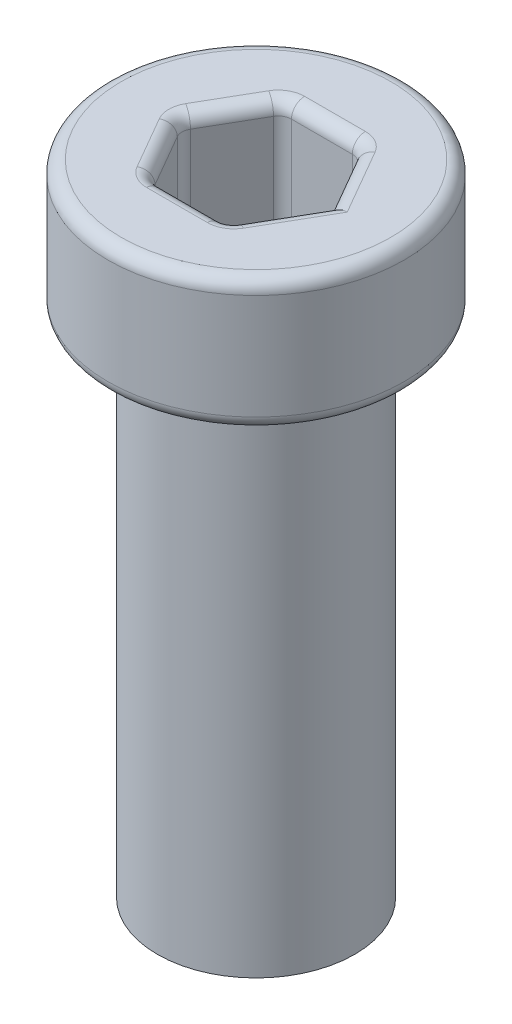
ISO-10303-21;
HEADER;
FILE_DESCRIPTION(('STEP AP214'),'2;1');
FILE_NAME('part.step','',(''),(''),'','','');
FILE_SCHEMA(('AUTOMOTIVE_DESIGN { 1 0 10303 214 1 1 1 1 }'));
ENDSEC;
DATA;
#1=APPLICATION_CONTEXT('core data for automotive mechanical design processes');
#2=APPLICATION_PROTOCOL_DEFINITION('international standard','automotive_design',2000,#1);
#3=PRODUCT_CONTEXT('',#1,'mechanical');
#4=PRODUCT('Part','Part','',(#3));
#5=PRODUCT_RELATED_PRODUCT_CATEGORY('part','',(#4));
#6=PRODUCT_DEFINITION_FORMATION('','',#4);
#7=PRODUCT_DEFINITION_CONTEXT('part definition',#1,'design');
#8=PRODUCT_DEFINITION('design','',#6,#7);
#9=PRODUCT_DEFINITION_SHAPE('','',#8);
#10=(LENGTH_UNIT() NAMED_UNIT(*) SI_UNIT(.MILLI.,.METRE.));
#11=(NAMED_UNIT(*) PLANE_ANGLE_UNIT() SI_UNIT($,.RADIAN.));
#12=(NAMED_UNIT(*) SI_UNIT($,.STERADIAN.) SOLID_ANGLE_UNIT());
#13=UNCERTAINTY_MEASURE_WITH_UNIT(LENGTH_MEASURE(1.E-05),#10,'distance_accuracy_value','');
#14=(GEOMETRIC_REPRESENTATION_CONTEXT(3) GLOBAL_UNCERTAINTY_ASSIGNED_CONTEXT((#13)) GLOBAL_UNIT_ASSIGNED_CONTEXT((#10,
#11,#12)) REPRESENTATION_CONTEXT('',''));
#15=CARTESIAN_POINT('',(0.,0.,0.));
#16=DIRECTION('',(0.,0.,1.));
#17=DIRECTION('',(1.,0.,0.));
#18=AXIS2_PLACEMENT_3D('',#15,#16,#17);
#19=CARTESIAN_POINT('',(0.,2.,0.));
#20=DIRECTION('',(0.,1.,0.));
#21=DIRECTION('',(0.,0.,1.));
#22=AXIS2_PLACEMENT_3D('',#19,#20,#21);
#23=PLANE('',#22);
#24=CARTESIAN_POINT('',(0.,2.,0.));
#25=DIRECTION('',(0.,1.,0.));
#26=DIRECTION('',(0.,0.,1.));
#27=AXIS2_PLACEMENT_3D('',#24,#25,#26);
#28=CIRCLE('',#27,2.05);
#29=CARTESIAN_POINT('',(0.,2.,2.05));
#30=VERTEX_POINT('',#29);
#31=EDGE_CURVE('E277',#30,#30,#28,.T.);
#32=ORIENTED_EDGE('',*,*,#31,.T.);
#33=EDGE_LOOP('',(#32));
#34=FACE_BOUND('',#33,.T.);
#35=CARTESIAN_POINT('',(0.4618802153517,2.,-0.8));
#36=DIRECTION('',(0.,1.,0.));
#37=DIRECTION('',(0.,0.,1.));
#38=AXIS2_PLACEMENT_3D('',#35,#36,#37);
#39=CIRCLE('',#38,0.4);
#40=CARTESIAN_POINT('',(0.808290376865476,2.,-1.));
#41=VERTEX_POINT('',#40);
#42=CARTESIAN_POINT('',(0.4618802153517,2.,-1.2));
#43=VERTEX_POINT('',#42);
#44=EDGE_CURVE('E58',#41,#43,#39,.T.);
#45=ORIENTED_EDGE('',*,*,#44,.F.);
#46=DIRECTION('',(-0.5,0.,-0.866025403784439));
#47=VECTOR('',#46,1.);
#48=CARTESIAN_POINT('',(1.03923048454133,2.,-0.6));
#49=LINE('',#48,#47);
#50=CARTESIAN_POINT('',(1.3856406460551,2.,0.));
#51=VERTEX_POINT('',#50);
#52=EDGE_CURVE('E302',#41,#51,#49,.F.);
#53=ORIENTED_EDGE('',*,*,#52,.T.);
#54=DIRECTION('',(0.5,0.,-0.866025403784439));
#55=VECTOR('',#54,1.);
#56=CARTESIAN_POINT('',(1.03923048454133,2.,0.6));
#57=LINE('',#56,#55);
#58=CARTESIAN_POINT('',(0.808290376865476,2.,1.));
#59=VERTEX_POINT('',#58);
#60=EDGE_CURVE('E300',#51,#59,#57,.F.);
#61=ORIENTED_EDGE('',*,*,#60,.T.);
#62=CARTESIAN_POINT('',(0.461880215351701,2.,0.8));
#63=DIRECTION('',(0.,1.,0.));
#64=DIRECTION('',(0.,0.,1.));
#65=AXIS2_PLACEMENT_3D('',#62,#63,#64);
#66=CIRCLE('',#65,0.4);
#67=CARTESIAN_POINT('',(0.461880215351701,2.,1.2));
#68=VERTEX_POINT('',#67);
#69=EDGE_CURVE('E297',#68,#59,#66,.T.);
#70=ORIENTED_EDGE('',*,*,#69,.F.);
#71=DIRECTION('',(1.,0.,0.));
#72=VECTOR('',#71,1.);
#73=CARTESIAN_POINT('',(0.,2.,1.2));
#74=LINE('',#73,#72);
#75=CARTESIAN_POINT('',(-0.4618802153517,2.,1.2));
#76=VERTEX_POINT('',#75);
#77=EDGE_CURVE('E293',#68,#76,#74,.F.);
#78=ORIENTED_EDGE('',*,*,#77,.T.);
#79=CARTESIAN_POINT('',(-0.4618802153517,2.,0.8));
#80=DIRECTION('',(0.,1.,0.));
#81=DIRECTION('',(0.,0.,1.));
#82=AXIS2_PLACEMENT_3D('',#79,#80,#81);
#83=CIRCLE('',#82,0.4);
#84=CARTESIAN_POINT('',(-0.808290376865476,2.,1.));
#85=VERTEX_POINT('',#84);
#86=EDGE_CURVE('E290',#85,#76,#83,.T.);
#87=ORIENTED_EDGE('',*,*,#86,.F.);
#88=DIRECTION('',(0.5,0.,0.866025403784438));
#89=VECTOR('',#88,1.);
#90=CARTESIAN_POINT('',(-1.03923048454133,2.,0.6));
#91=LINE('',#90,#89);
#92=CARTESIAN_POINT('',(-1.27017059221718,2.,0.2));
#93=VERTEX_POINT('',#92);
#94=EDGE_CURVE('E288',#85,#93,#91,.F.);
#95=ORIENTED_EDGE('',*,*,#94,.T.);
#96=CARTESIAN_POINT('',(-0.923760430703401,2.,0.));
#97=DIRECTION('',(0.,1.,0.));
#98=DIRECTION('',(0.,0.,1.));
#99=AXIS2_PLACEMENT_3D('',#96,#97,#98);
#100=CIRCLE('',#99,0.4);
#101=CARTESIAN_POINT('',(-1.27017059221718,2.,-0.199999999999999));
#102=VERTEX_POINT('',#101);
#103=EDGE_CURVE('E285',#102,#93,#100,.T.);
#104=ORIENTED_EDGE('',*,*,#103,.F.);
#105=DIRECTION('',(-0.5,0.,0.866025403784439));
#106=VECTOR('',#105,1.);
#107=CARTESIAN_POINT('',(-1.03923048454133,2.,-0.599999999999999));
#108=LINE('',#107,#106);
#109=CARTESIAN_POINT('',(-0.808290376865476,2.,-1.));
#110=VERTEX_POINT('',#109);
#111=EDGE_CURVE('E283',#102,#110,#108,.F.);
#112=ORIENTED_EDGE('',*,*,#111,.T.);
#113=CARTESIAN_POINT('',(-0.461880215351701,2.,-0.8));
#114=DIRECTION('',(0.,1.,0.));
#115=DIRECTION('',(0.,0.,1.));
#116=AXIS2_PLACEMENT_3D('',#113,#114,#115);
#117=CIRCLE('',#116,0.4);
#118=CARTESIAN_POINT('',(-0.461880215351701,2.,-1.2));
#119=VERTEX_POINT('',#118);
#120=EDGE_CURVE('E280',#119,#110,#117,.T.);
#121=ORIENTED_EDGE('',*,*,#120,.F.);
#122=DIRECTION('',(-1.,0.,0.));
#123=VECTOR('',#122,1.);
#124=CARTESIAN_POINT('',(0.,2.,-1.2));
#125=LINE('',#124,#123);
#126=EDGE_CURVE('E295',#119,#43,#125,.F.);
#127=ORIENTED_EDGE('',*,*,#126,.T.);
#128=EDGE_LOOP('',(#45,#53,#61,#70,#78,#87,#95,#104,#112,#121,#127));
#129=FACE_BOUND('',#128,.T.);
#130=ADVANCED_FACE('F41',(#34,#129),#23,.T.);
#131=CARTESIAN_POINT('',(0.,0.,0.));
#132=DIRECTION('',(0.,1.,0.));
#133=DIRECTION('',(0.,0.,1.));
#134=AXIS2_PLACEMENT_3D('',#131,#132,#133);
#135=PLANE('',#134);
#136=CARTESIAN_POINT('',(0.,0.,0.));
#137=DIRECTION('',(0.,1.,0.));
#138=DIRECTION('',(0.,0.,1.));
#139=AXIS2_PLACEMENT_3D('',#136,#137,#138);
#140=CIRCLE('',#139,2.05);
#141=CARTESIAN_POINT('',(0.,0.,2.05));
#142=VERTEX_POINT('',#141);
#143=EDGE_CURVE('E11',#142,#142,#140,.F.);
#144=ORIENTED_EDGE('',*,*,#143,.T.);
#145=EDGE_LOOP('',(#144));
#146=FACE_BOUND('',#145,.T.);
#147=CARTESIAN_POINT('',(0.,0.,0.));
#148=DIRECTION('',(0.,1.,0.));
#149=DIRECTION('',(0.,0.,1.));
#150=AXIS2_PLACEMENT_3D('',#147,#148,#149);
#151=CIRCLE('',#150,1.5);
#152=CARTESIAN_POINT('',(0.,0.,1.5));
#153=VERTEX_POINT('',#152);
#154=EDGE_CURVE('E384',#153,#153,#151,.T.);
#155=ORIENTED_EDGE('',*,*,#154,.T.);
#156=EDGE_LOOP('',(#155));
#157=FACE_BOUND('',#156,.T.);
#158=ADVANCED_FACE('F419',(#146,#157),#135,.F.);
#159=CARTESIAN_POINT('',(0.,2.,0.));
#160=DIRECTION('',(0.,-1.,0.));
#161=DIRECTION('',(0.,0.,-1.));
#162=AXIS2_PLACEMENT_3D('',#159,#160,#161);
#163=CYLINDRICAL_SURFACE('',#162,2.25);
#164=CARTESIAN_POINT('',(0.,0.2,0.));
#165=DIRECTION('',(0.,1.,0.));
#166=DIRECTION('',(0.,0.,1.));
#167=AXIS2_PLACEMENT_3D('',#164,#165,#166);
#168=CIRCLE('',#167,2.25);
#169=CARTESIAN_POINT('',(0.,0.2,2.25));
#170=VERTEX_POINT('',#169);
#171=EDGE_CURVE('E50',#170,#170,#168,.T.);
#172=ORIENTED_EDGE('',*,*,#171,.T.);
#173=EDGE_LOOP('',(#172));
#174=FACE_BOUND('',#173,.T.);
#175=CARTESIAN_POINT('',(0.,1.8,0.));
#176=DIRECTION('',(0.,1.,0.));
#177=DIRECTION('',(0.,0.,1.));
#178=AXIS2_PLACEMENT_3D('',#175,#176,#177);
#179=CIRCLE('',#178,2.25);
#180=CARTESIAN_POINT('',(0.,1.8,2.25));
#181=VERTEX_POINT('',#180);
#182=EDGE_CURVE('E305',#181,#181,#179,.F.);
#183=ORIENTED_EDGE('',*,*,#182,.T.);
#184=EDGE_LOOP('',(#183));
#185=FACE_BOUND('',#184,.T.);
#186=ADVANCED_FACE('F425',(#174,#185),#163,.T.);
#187=CARTESIAN_POINT('',(0.577350269189626,2.,-1.));
#188=DIRECTION('',(0.,0.,1.));
#189=DIRECTION('',(1.,0.,0.));
#190=AXIS2_PLACEMENT_3D('',#187,#188,#189);
#191=PLANE('',#190);
#192=DIRECTION('',(0.,-1.,0.));
#193=VECTOR('',#192,1.);
#194=CARTESIAN_POINT('',(-0.461880215351701,0.,-1.));
#195=LINE('',#194,#193);
#196=CARTESIAN_POINT('',(-0.461880215351701,1.8,-1.));
#197=VERTEX_POINT('',#196);
#198=CARTESIAN_POINT('',(-0.461880215351701,0.2,-1.));
#199=VERTEX_POINT('',#198);
#200=EDGE_CURVE('E190',#197,#199,#195,.T.);
#201=ORIENTED_EDGE('',*,*,#200,.T.);
#202=DIRECTION('',(-1.,0.,0.));
#203=VECTOR('',#202,1.);
#204=CARTESIAN_POINT('',(0.577350269189626,0.2,-1.));
#205=LINE('',#204,#203);
#206=CARTESIAN_POINT('',(0.4618802153517,0.2,-1.));
#207=VERTEX_POINT('',#206);
#208=EDGE_CURVE('E186',#199,#207,#205,.F.);
#209=ORIENTED_EDGE('',*,*,#208,.T.);
#210=DIRECTION('',(0.,-1.,0.));
#211=VECTOR('',#210,1.);
#212=CARTESIAN_POINT('',(0.4618802153517,2.,-1.));
#213=LINE('',#212,#211);
#214=CARTESIAN_POINT('',(0.4618802153517,1.8,-1.));
#215=VERTEX_POINT('',#214);
#216=EDGE_CURVE('E178',#207,#215,#213,.F.);
#217=ORIENTED_EDGE('',*,*,#216,.T.);
#218=DIRECTION('',(-1.,0.,0.));
#219=VECTOR('',#218,1.);
#220=CARTESIAN_POINT('',(0.577350269189626,1.8,-1.));
#221=LINE('',#220,#219);
#222=EDGE_CURVE('E183',#215,#197,#221,.T.);
#223=ORIENTED_EDGE('',*,*,#222,.T.);
#224=EDGE_LOOP('',(#201,#209,#217,#223));
#225=FACE_BOUND('',#224,.T.);
#226=ADVANCED_FACE('F181',(#225),#191,.T.);
#227=CARTESIAN_POINT('',(-0.577350269189626,2.,-1.));
#228=DIRECTION('',(0.866025403784439,0.,0.5));
#229=DIRECTION('',(0.5,0.,-0.866025403784439));
#230=AXIS2_PLACEMENT_3D('',#227,#228,#229);
#231=PLANE('',#230);
#232=DIRECTION('',(0.,-1.,0.));
#233=VECTOR('',#232,1.);
#234=CARTESIAN_POINT('',(-1.09696551146029,0.,-0.0999999999999996));
#235=LINE('',#234,#233);
#236=CARTESIAN_POINT('',(-1.09696551146029,1.8,-0.0999999999999995));
#237=VERTEX_POINT('',#236);
#238=CARTESIAN_POINT('',(-1.09696551146029,0.2,-0.0999999999999996));
#239=VERTEX_POINT('',#238);
#240=EDGE_CURVE('E227',#237,#239,#235,.T.);
#241=ORIENTED_EDGE('',*,*,#240,.T.);
#242=DIRECTION('',(-0.5,0.,0.866025403784439));
#243=VECTOR('',#242,1.);
#244=CARTESIAN_POINT('',(-0.577350269189626,0.2,-1.));
#245=LINE('',#244,#243);
#246=CARTESIAN_POINT('',(-0.635085296108588,0.2,-0.9));
#247=VERTEX_POINT('',#246);
#248=EDGE_CURVE('E232',#239,#247,#245,.F.);
#249=ORIENTED_EDGE('',*,*,#248,.T.);
#250=DIRECTION('',(0.,-1.,0.));
#251=VECTOR('',#250,1.);
#252=CARTESIAN_POINT('',(-0.635085296108588,2.,-0.9));
#253=LINE('',#252,#251);
#254=CARTESIAN_POINT('',(-0.635085296108588,1.8,-0.9));
#255=VERTEX_POINT('',#254);
#256=EDGE_CURVE('E229',#247,#255,#253,.F.);
#257=ORIENTED_EDGE('',*,*,#256,.T.);
#258=DIRECTION('',(-0.5,0.,0.866025403784439));
#259=VECTOR('',#258,1.);
#260=CARTESIAN_POINT('',(-0.577350269189626,1.8,-1.));
#261=LINE('',#260,#259);
#262=EDGE_CURVE('E225',#255,#237,#261,.T.);
#263=ORIENTED_EDGE('',*,*,#262,.T.);
#264=EDGE_LOOP('',(#241,#249,#257,#263));
#265=FACE_BOUND('',#264,.T.);
#266=ADVANCED_FACE('F435',(#265),#231,.T.);
#267=CARTESIAN_POINT('',(-1.15470053837925,2.,0.));
#268=DIRECTION('',(0.866025403784439,0.,-0.5));
#269=DIRECTION('',(-0.5,0.,-0.866025403784438));
#270=AXIS2_PLACEMENT_3D('',#267,#268,#269);
#271=PLANE('',#270);
#272=DIRECTION('',(0.,-1.,0.));
#273=VECTOR('',#272,1.);
#274=CARTESIAN_POINT('',(-0.635085296108588,0.,0.9));
#275=LINE('',#274,#273);
#276=CARTESIAN_POINT('',(-0.635085296108588,1.8,0.9));
#277=VERTEX_POINT('',#276);
#278=CARTESIAN_POINT('',(-0.635085296108588,0.2,0.9));
#279=VERTEX_POINT('',#278);
#280=EDGE_CURVE('E236',#277,#279,#275,.T.);
#281=ORIENTED_EDGE('',*,*,#280,.T.);
#282=DIRECTION('',(0.5,0.,0.866025403784438));
#283=VECTOR('',#282,1.);
#284=CARTESIAN_POINT('',(-1.15470053837925,0.2,0.));
#285=LINE('',#284,#283);
#286=CARTESIAN_POINT('',(-1.09696551146029,0.2,0.1));
#287=VERTEX_POINT('',#286);
#288=EDGE_CURVE('E241',#279,#287,#285,.F.);
#289=ORIENTED_EDGE('',*,*,#288,.T.);
#290=DIRECTION('',(0.,-1.,0.));
#291=VECTOR('',#290,1.);
#292=CARTESIAN_POINT('',(-1.09696551146029,2.,0.1));
#293=LINE('',#292,#291);
#294=CARTESIAN_POINT('',(-1.09696551146029,1.8,0.1));
#295=VERTEX_POINT('',#294);
#296=EDGE_CURVE('E238',#287,#295,#293,.F.);
#297=ORIENTED_EDGE('',*,*,#296,.T.);
#298=DIRECTION('',(0.5,0.,0.866025403784438));
#299=VECTOR('',#298,1.);
#300=CARTESIAN_POINT('',(-1.15470053837925,1.8,0.));
#301=LINE('',#300,#299);
#302=EDGE_CURVE('E234',#295,#277,#301,.T.);
#303=ORIENTED_EDGE('',*,*,#302,.T.);
#304=EDGE_LOOP('',(#281,#289,#297,#303));
#305=FACE_BOUND('',#304,.T.);
#306=ADVANCED_FACE('F606',(#305),#271,.T.);
#307=CARTESIAN_POINT('',(-0.577350269189625,2.,1.));
#308=DIRECTION('',(0.,0.,-1.));
#309=DIRECTION('',(-1.,0.,0.));
#310=AXIS2_PLACEMENT_3D('',#307,#308,#309);
#311=PLANE('',#310);
#312=DIRECTION('',(0.,-1.,0.));
#313=VECTOR('',#312,1.);
#314=CARTESIAN_POINT('',(0.461880215351701,0.,1.));
#315=LINE('',#314,#313);
#316=CARTESIAN_POINT('',(0.461880215351701,1.8,1.));
#317=VERTEX_POINT('',#316);
#318=CARTESIAN_POINT('',(0.461880215351701,0.2,1.));
#319=VERTEX_POINT('',#318);
#320=EDGE_CURVE('E245',#317,#319,#315,.T.);
#321=ORIENTED_EDGE('',*,*,#320,.T.);
#322=DIRECTION('',(1.,0.,0.));
#323=VECTOR('',#322,1.);
#324=CARTESIAN_POINT('',(-0.577350269189625,0.2,1.));
#325=LINE('',#324,#323);
#326=CARTESIAN_POINT('',(-0.4618802153517,0.2,1.));
#327=VERTEX_POINT('',#326);
#328=EDGE_CURVE('E250',#319,#327,#325,.F.);
#329=ORIENTED_EDGE('',*,*,#328,.T.);
#330=DIRECTION('',(0.,-1.,0.));
#331=VECTOR('',#330,1.);
#332=CARTESIAN_POINT('',(-0.4618802153517,2.,1.));
#333=LINE('',#332,#331);
#334=CARTESIAN_POINT('',(-0.4618802153517,1.8,1.));
#335=VERTEX_POINT('',#334);
#336=EDGE_CURVE('E247',#327,#335,#333,.F.);
#337=ORIENTED_EDGE('',*,*,#336,.T.);
#338=DIRECTION('',(1.,0.,0.));
#339=VECTOR('',#338,1.);
#340=CARTESIAN_POINT('',(-0.577350269189625,1.8,1.));
#341=LINE('',#340,#339);
#342=EDGE_CURVE('E243',#335,#317,#341,.T.);
#343=ORIENTED_EDGE('',*,*,#342,.T.);
#344=EDGE_LOOP('',(#321,#329,#337,#343));
#345=FACE_BOUND('',#344,.T.);
#346=ADVANCED_FACE('F604',(#345),#311,.T.);
#347=CARTESIAN_POINT('',(0.577350269189626,2.,1.));
#348=DIRECTION('',(-0.866025403784439,0.,-0.5));
#349=DIRECTION('',(-0.5,0.,0.866025403784439));
#350=AXIS2_PLACEMENT_3D('',#347,#348,#349);
#351=PLANE('',#350);
#352=DIRECTION('',(0.,-1.,0.));
#353=VECTOR('',#352,1.);
#354=CARTESIAN_POINT('',(1.15470053837925,2.,0.));
#355=LINE('',#354,#353);
#356=CARTESIAN_POINT('',(1.15470053837925,1.8,0.));
#357=VERTEX_POINT('',#356);
#358=CARTESIAN_POINT('',(1.15470053837925,0.2,0.));
#359=VERTEX_POINT('',#358);
#360=EDGE_CURVE('E387',#357,#359,#355,.T.);
#361=ORIENTED_EDGE('',*,*,#360,.T.);
#362=DIRECTION('',(0.5,0.,-0.866025403784439));
#363=VECTOR('',#362,1.);
#364=CARTESIAN_POINT('',(0.577350269189626,0.2,1.));
#365=LINE('',#364,#363);
#366=CARTESIAN_POINT('',(0.635085296108589,0.2,0.9));
#367=VERTEX_POINT('',#366);
#368=EDGE_CURVE('E257',#359,#367,#365,.F.);
#369=ORIENTED_EDGE('',*,*,#368,.T.);
#370=DIRECTION('',(0.,-1.,0.));
#371=VECTOR('',#370,1.);
#372=CARTESIAN_POINT('',(0.635085296108588,2.,0.9));
#373=LINE('',#372,#371);
#374=CARTESIAN_POINT('',(0.635085296108589,1.8,0.9));
#375=VERTEX_POINT('',#374);
#376=EDGE_CURVE('E254',#367,#375,#373,.F.);
#377=ORIENTED_EDGE('',*,*,#376,.T.);
#378=DIRECTION('',(0.5,0.,-0.866025403784439));
#379=VECTOR('',#378,1.);
#380=CARTESIAN_POINT('',(0.577350269189626,1.8,1.));
#381=LINE('',#380,#379);
#382=EDGE_CURVE('E252',#375,#357,#381,.T.);
#383=ORIENTED_EDGE('',*,*,#382,.T.);
#384=EDGE_LOOP('',(#361,#369,#377,#383));
#385=FACE_BOUND('',#384,.T.);
#386=ADVANCED_FACE('F570',(#385),#351,.T.);
#387=CARTESIAN_POINT('',(1.15470053837925,2.,0.));
#388=DIRECTION('',(-0.866025403784439,0.,0.5));
#389=DIRECTION('',(0.5,0.,0.866025403784439));
#390=AXIS2_PLACEMENT_3D('',#387,#388,#389);
#391=PLANE('',#390);
#392=DIRECTION('',(0.,-1.,0.));
#393=VECTOR('',#392,1.);
#394=CARTESIAN_POINT('',(0.635085296108588,0.,-0.9));
#395=LINE('',#394,#393);
#396=CARTESIAN_POINT('',(0.635085296108588,1.8,-0.9));
#397=VERTEX_POINT('',#396);
#398=CARTESIAN_POINT('',(0.635085296108588,0.2,-0.9));
#399=VERTEX_POINT('',#398);
#400=EDGE_CURVE('E197',#397,#399,#395,.T.);
#401=ORIENTED_EDGE('',*,*,#400,.T.);
#402=DIRECTION('',(-0.5,0.,-0.866025403784439));
#403=VECTOR('',#402,1.);
#404=CARTESIAN_POINT('',(1.15470053837925,0.2,0.));
#405=LINE('',#404,#403);
#406=EDGE_CURVE('E262',#399,#359,#405,.F.);
#407=ORIENTED_EDGE('',*,*,#406,.T.);
#408=ORIENTED_EDGE('',*,*,#360,.F.);
#409=DIRECTION('',(-0.5,0.,-0.866025403784439));
#410=VECTOR('',#409,1.);
#411=CARTESIAN_POINT('',(1.15470053837925,1.8,0.));
#412=LINE('',#411,#410);
#413=EDGE_CURVE('E259',#357,#397,#412,.T.);
#414=ORIENTED_EDGE('',*,*,#413,.T.);
#415=EDGE_LOOP('',(#401,#407,#408,#414));
#416=FACE_BOUND('',#415,.T.);
#417=ADVANCED_FACE('F567',(#416),#391,.T.);
#418=CARTESIAN_POINT('',(0.,0.,0.));
#419=DIRECTION('',(0.,1.,0.));
#420=DIRECTION('',(0.,0.,1.));
#421=AXIS2_PLACEMENT_3D('',#418,#419,#420);
#422=PLANE('',#421);
#423=DIRECTION('',(-0.5,0.,-0.866025403784439));
#424=VECTOR('',#423,1.);
#425=CARTESIAN_POINT('',(0.404145188432738,0.,-0.9));
#426=LINE('',#425,#424);
#427=CARTESIAN_POINT('',(0.923760430703401,0.,0.));
#428=VERTEX_POINT('',#427);
#429=CARTESIAN_POINT('',(0.461880215351701,0.,-0.8));
#430=VERTEX_POINT('',#429);
#431=EDGE_CURVE('E272',#428,#430,#426,.T.);
#432=ORIENTED_EDGE('',*,*,#431,.T.);
#433=DIRECTION('',(-1.,0.,0.));
#434=VECTOR('',#433,1.);
#435=CARTESIAN_POINT('',(-0.577350269189626,0.,-0.8));
#436=LINE('',#435,#434);
#437=CARTESIAN_POINT('',(-0.461880215351701,0.,-0.8));
#438=VERTEX_POINT('',#437);
#439=EDGE_CURVE('E274',#430,#438,#436,.T.);
#440=ORIENTED_EDGE('',*,*,#439,.T.);
#441=DIRECTION('',(-0.5,0.,0.866025403784439));
#442=VECTOR('',#441,1.);
#443=CARTESIAN_POINT('',(-0.981495457622363,0.,0.1));
#444=LINE('',#443,#442);
#445=CARTESIAN_POINT('',(-0.923760430703401,0.,0.));
#446=VERTEX_POINT('',#445);
#447=EDGE_CURVE('E270',#438,#446,#444,.T.);
#448=ORIENTED_EDGE('',*,*,#447,.T.);
#449=DIRECTION('',(0.5,0.,0.866025403784438));
#450=VECTOR('',#449,1.);
#451=CARTESIAN_POINT('',(-0.404145188432738,0.,0.9));
#452=LINE('',#451,#450);
#453=CARTESIAN_POINT('',(-0.4618802153517,0.,0.8));
#454=VERTEX_POINT('',#453);
#455=EDGE_CURVE('E268',#446,#454,#452,.T.);
#456=ORIENTED_EDGE('',*,*,#455,.T.);
#457=DIRECTION('',(1.,0.,0.));
#458=VECTOR('',#457,1.);
#459=CARTESIAN_POINT('',(0.577350269189626,0.,0.8));
#460=LINE('',#459,#458);
#461=CARTESIAN_POINT('',(0.461880215351701,0.,0.8));
#462=VERTEX_POINT('',#461);
#463=EDGE_CURVE('E264',#454,#462,#460,.T.);
#464=ORIENTED_EDGE('',*,*,#463,.T.);
#465=DIRECTION('',(0.5,0.,-0.866025403784439));
#466=VECTOR('',#465,1.);
#467=CARTESIAN_POINT('',(0.981495457622364,0.,-0.1));
#468=LINE('',#467,#466);
#469=EDGE_CURVE('E266',#462,#428,#468,.T.);
#470=ORIENTED_EDGE('',*,*,#469,.T.);
#471=EDGE_LOOP('',(#432,#440,#448,#456,#464,#470));
#472=FACE_BOUND('',#471,.T.);
#473=ADVANCED_FACE('F558',(#472),#422,.T.);
#474=CARTESIAN_POINT('',(0.,-8.,0.));
#475=DIRECTION('',(0.,1.,0.));
#476=DIRECTION('',(0.,0.,1.));
#477=AXIS2_PLACEMENT_3D('',#474,#475,#476);
#478=CYLINDRICAL_SURFACE('',#477,1.5);
#479=CARTESIAN_POINT('',(0.,-7.71132486540519,0.));
#480=DIRECTION('',(0.,1.,0.));
#481=DIRECTION('',(0.,0.,1.));
#482=AXIS2_PLACEMENT_3D('',#479,#480,#481);
#483=CIRCLE('',#482,1.5);
#484=CARTESIAN_POINT('',(0.,-7.71132486540519,1.5));
#485=VERTEX_POINT('',#484);
#486=EDGE_CURVE('E219',#485,#485,#483,.T.);
#487=ORIENTED_EDGE('',*,*,#486,.T.);
#488=EDGE_LOOP('',(#487));
#489=FACE_BOUND('',#488,.T.);
#490=ORIENTED_EDGE('',*,*,#154,.F.);
#491=EDGE_LOOP('',(#490));
#492=FACE_BOUND('',#491,.T.);
#493=ADVANCED_FACE('F396',(#489,#492),#478,.T.);
#494=CARTESIAN_POINT('',(0.,-8.,0.));
#495=DIRECTION('',(0.,1.,0.));
#496=DIRECTION('',(0.,0.,1.));
#497=AXIS2_PLACEMENT_3D('',#494,#495,#496);
#498=PLANE('',#497);
#499=CARTESIAN_POINT('',(0.,-8.,0.));
#500=DIRECTION('',(0.,1.,0.));
#501=DIRECTION('',(0.,0.,1.));
#502=AXIS2_PLACEMENT_3D('',#499,#500,#501);
#503=CIRCLE('',#502,0.999999999999997);
#504=CARTESIAN_POINT('',(0.,-8.,0.999999999999997));
#505=VERTEX_POINT('',#504);
#506=EDGE_CURVE('E216',#505,#505,#503,.F.);
#507=ORIENTED_EDGE('',*,*,#506,.T.);
#508=EDGE_LOOP('',(#507));
#509=FACE_BOUND('',#508,.T.);
#510=ADVANCED_FACE('F402',(#509),#498,.F.);
#511=CARTESIAN_POINT('',(0.,-7.71132486540519,0.));
#512=DIRECTION('',(0.,1.,0.));
#513=DIRECTION('',(0.,0.,1.));
#514=AXIS2_PLACEMENT_3D('',#511,#512,#513);
#515=CONICAL_SURFACE('',#514,1.5,1.0471975511966);
#516=ORIENTED_EDGE('',*,*,#506,.F.);
#517=EDGE_LOOP('',(#516));
#518=FACE_BOUND('',#517,.T.);
#519=ORIENTED_EDGE('',*,*,#486,.F.);
#520=EDGE_LOOP('',(#519));
#521=FACE_BOUND('',#520,.T.);
#522=ADVANCED_FACE('F399',(#518,#521),#515,.T.);
#523=CARTESIAN_POINT('',(0.461880215351701,2.,0.8));
#524=DIRECTION('',(0.,1.,0.));
#525=DIRECTION('',(0.,0.,1.));
#526=AXIS2_PLACEMENT_3D('',#523,#524,#525);
#527=CYLINDRICAL_SURFACE('',#526,0.2);
#528=CARTESIAN_POINT('',(0.461880215351701,0.2,0.8));
#529=DIRECTION('',(0.,1.,0.));
#530=DIRECTION('',(0.,0.,1.));
#531=AXIS2_PLACEMENT_3D('',#528,#529,#530);
#532=CIRCLE('',#531,0.2);
#533=EDGE_CURVE('E376',#319,#367,#532,.T.);
#534=ORIENTED_EDGE('',*,*,#533,.F.);
#535=ORIENTED_EDGE('',*,*,#320,.F.);
#536=CARTESIAN_POINT('',(0.461880215351701,1.8,0.8));
#537=DIRECTION('',(0.,1.,0.));
#538=DIRECTION('',(0.,0.,1.));
#539=AXIS2_PLACEMENT_3D('',#536,#537,#538);
#540=CIRCLE('',#539,0.2);
#541=EDGE_CURVE('E378',#375,#317,#540,.F.);
#542=ORIENTED_EDGE('',*,*,#541,.F.);
#543=ORIENTED_EDGE('',*,*,#376,.F.);
#544=EDGE_LOOP('',(#534,#535,#542,#543));
#545=FACE_BOUND('',#544,.T.);
#546=ADVANCED_FACE('F401',(#545),#527,.F.);
#547=CARTESIAN_POINT('',(-0.577350269189625,1.8,1.2));
#548=DIRECTION('',(1.,0.,0.));
#549=DIRECTION('',(0.,0.,-1.));
#550=AXIS2_PLACEMENT_3D('',#547,#548,#549);
#551=CYLINDRICAL_SURFACE('',#550,0.2);
#552=CARTESIAN_POINT('',(-0.4618802153517,1.8,1.2));
#553=DIRECTION('',(-1.,0.,0.));
#554=DIRECTION('',(0.,0.,1.));
#555=AXIS2_PLACEMENT_3D('',#552,#553,#554);
#556=CIRCLE('',#555,0.2);
#557=EDGE_CURVE('E368',#76,#335,#556,.T.);
#558=ORIENTED_EDGE('',*,*,#557,.F.);
#559=ORIENTED_EDGE('',*,*,#77,.F.);
#560=CARTESIAN_POINT('',(0.461880215351701,1.8,1.2));
#561=DIRECTION('',(1.,0.,0.));
#562=DIRECTION('',(0.,0.,-1.));
#563=AXIS2_PLACEMENT_3D('',#560,#561,#562);
#564=CIRCLE('',#563,0.2);
#565=EDGE_CURVE('E45',#317,#68,#564,.T.);
#566=ORIENTED_EDGE('',*,*,#565,.F.);
#567=ORIENTED_EDGE('',*,*,#342,.F.);
#568=EDGE_LOOP('',(#558,#559,#566,#567));
#569=FACE_BOUND('',#568,.T.);
#570=ADVANCED_FACE('F409',(#569),#551,.T.);
#571=CARTESIAN_POINT('',(0.461880215351701,1.8,0.8));
#572=DIRECTION('',(0.,1.,0.));
#573=DIRECTION('',(0.,0.,1.));
#574=AXIS2_PLACEMENT_3D('',#571,#572,#573);
#575=TOROIDAL_SURFACE('',#574,0.4,0.2);
#576=ORIENTED_EDGE('',*,*,#565,.T.);
#577=ORIENTED_EDGE('',*,*,#69,.T.);
#578=CARTESIAN_POINT('',(0.808290376865476,1.8,1.));
#579=DIRECTION('',(-0.5,0.,0.866025403784438));
#580=DIRECTION('',(0.866025403784439,0.,0.5));
#581=AXIS2_PLACEMENT_3D('',#578,#579,#580);
#582=CIRCLE('',#581,0.2);
#583=EDGE_CURVE('E365',#375,#59,#582,.F.);
#584=ORIENTED_EDGE('',*,*,#583,.F.);
#585=ORIENTED_EDGE('',*,*,#541,.T.);
#586=EDGE_LOOP('',(#576,#577,#584,#585));
#587=FACE_BOUND('',#586,.T.);
#588=ADVANCED_FACE('F459',(#587),#575,.T.);
#589=CARTESIAN_POINT('',(0.461880215351701,0.2,0.8));
#590=DIRECTION('',(0.,0.,1.));
#591=DIRECTION('',(1.,0.,0.));
#592=AXIS2_PLACEMENT_3D('',#589,#590,#591);
#593=SPHERICAL_SURFACE('',#592,0.2);
#594=CARTESIAN_POINT('',(0.461880215351701,0.2,0.8));
#595=DIRECTION('',(0.5,0.,-0.866025403784439));
#596=DIRECTION('',(-0.866025403784439,0.,-0.5));
#597=AXIS2_PLACEMENT_3D('',#594,#595,#596);
#598=CIRCLE('',#597,0.2);
#599=EDGE_CURVE('E362',#462,#367,#598,.F.);
#600=ORIENTED_EDGE('',*,*,#599,.F.);
#601=CARTESIAN_POINT('',(0.461880215351701,0.2,0.8));
#602=DIRECTION('',(-1.,0.,0.));
#603=DIRECTION('',(0.,0.,1.));
#604=AXIS2_PLACEMENT_3D('',#601,#602,#603);
#605=CIRCLE('',#604,0.2);
#606=EDGE_CURVE('E373',#319,#462,#605,.F.);
#607=ORIENTED_EDGE('',*,*,#606,.F.);
#608=ORIENTED_EDGE('',*,*,#533,.T.);
#609=EDGE_LOOP('',(#600,#607,#608));
#610=FACE_BOUND('',#609,.T.);
#611=ADVANCED_FACE('F463',(#610),#593,.F.);
#612=CARTESIAN_POINT('',(0.,0.2,0.8));
#613=DIRECTION('',(-1.,0.,0.));
#614=DIRECTION('',(0.,0.,1.));
#615=AXIS2_PLACEMENT_3D('',#612,#613,#614);
#616=CYLINDRICAL_SURFACE('',#615,0.2);
#617=ORIENTED_EDGE('',*,*,#606,.T.);
#618=ORIENTED_EDGE('',*,*,#463,.F.);
#619=CARTESIAN_POINT('',(-0.4618802153517,0.2,0.8));
#620=DIRECTION('',(1.,0.,0.));
#621=DIRECTION('',(0.,0.,-1.));
#622=AXIS2_PLACEMENT_3D('',#619,#620,#621);
#623=CIRCLE('',#622,0.2);
#624=EDGE_CURVE('E359',#327,#454,#623,.T.);
#625=ORIENTED_EDGE('',*,*,#624,.F.);
#626=ORIENTED_EDGE('',*,*,#328,.F.);
#627=EDGE_LOOP('',(#617,#618,#625,#626));
#628=FACE_BOUND('',#627,.T.);
#629=ADVANCED_FACE('F466',(#628),#616,.F.);
#630=CARTESIAN_POINT('',(-0.4618802153517,2.,0.8));
#631=DIRECTION('',(0.,1.,0.));
#632=DIRECTION('',(0.,0.,1.));
#633=AXIS2_PLACEMENT_3D('',#630,#631,#632);
#634=CYLINDRICAL_SURFACE('',#633,0.2);
#635=CARTESIAN_POINT('',(-0.4618802153517,1.8,0.8));
#636=DIRECTION('',(0.,1.,0.));
#637=DIRECTION('',(0.,0.,1.));
#638=AXIS2_PLACEMENT_3D('',#635,#636,#637);
#639=CIRCLE('',#638,0.2);
#640=EDGE_CURVE('E370',#335,#277,#639,.F.);
#641=ORIENTED_EDGE('',*,*,#640,.F.);
#642=ORIENTED_EDGE('',*,*,#336,.F.);
#643=CARTESIAN_POINT('',(-0.4618802153517,0.2,0.8));
#644=DIRECTION('',(0.,1.,0.));
#645=DIRECTION('',(0.,0.,1.));
#646=AXIS2_PLACEMENT_3D('',#643,#644,#645);
#647=CIRCLE('',#646,0.2);
#648=EDGE_CURVE('E356',#279,#327,#647,.T.);
#649=ORIENTED_EDGE('',*,*,#648,.F.);
#650=ORIENTED_EDGE('',*,*,#280,.F.);
#651=EDGE_LOOP('',(#641,#642,#649,#650));
#652=FACE_BOUND('',#651,.T.);
#653=ADVANCED_FACE('F470',(#652),#634,.F.);
#654=CARTESIAN_POINT('',(-0.4618802153517,1.8,0.8));
#655=DIRECTION('',(0.,1.,0.));
#656=DIRECTION('',(0.,0.,1.));
#657=AXIS2_PLACEMENT_3D('',#654,#655,#656);
#658=TOROIDAL_SURFACE('',#657,0.4,0.2);
#659=ORIENTED_EDGE('',*,*,#557,.T.);
#660=ORIENTED_EDGE('',*,*,#640,.T.);
#661=CARTESIAN_POINT('',(-0.808290376865476,1.8,1.));
#662=DIRECTION('',(0.5,0.,0.866025403784438));
#663=DIRECTION('',(0.866025403784439,0.,-0.5));
#664=AXIS2_PLACEMENT_3D('',#661,#662,#663);
#665=CIRCLE('',#664,0.2);
#666=EDGE_CURVE('E353',#85,#277,#665,.F.);
#667=ORIENTED_EDGE('',*,*,#666,.F.);
#668=ORIENTED_EDGE('',*,*,#86,.T.);
#669=EDGE_LOOP('',(#659,#660,#667,#668));
#670=FACE_BOUND('',#669,.T.);
#671=ADVANCED_FACE('F474',(#670),#658,.T.);
#672=CARTESIAN_POINT('',(0.750555349946514,1.8,1.1));
#673=DIRECTION('',(0.5,0.,-0.866025403784439));
#674=DIRECTION('',(-0.866025403784439,0.,-0.5));
#675=AXIS2_PLACEMENT_3D('',#672,#673,#674);
#676=CYLINDRICAL_SURFACE('',#675,0.2);
#677=ORIENTED_EDGE('',*,*,#583,.T.);
#678=ORIENTED_EDGE('',*,*,#60,.F.);
#679=CARTESIAN_POINT('',(1.3856406460551,1.8,0.));
#680=DIRECTION('',(0.,0.,-1.));
#681=DIRECTION('',(-1.,0.,0.));
#682=AXIS2_PLACEMENT_3D('',#679,#680,#681);
#683=ELLIPSE('',#682,0.23094010767585,0.2);
#684=EDGE_CURVE('E65',#357,#51,#683,.T.);
#685=ORIENTED_EDGE('',*,*,#684,.F.);
#686=ORIENTED_EDGE('',*,*,#382,.F.);
#687=EDGE_LOOP('',(#677,#678,#685,#686));
#688=FACE_BOUND('',#687,.T.);
#689=ADVANCED_FACE('F478',(#688),#676,.T.);
#690=CARTESIAN_POINT('',(0.692820323027551,0.2,0.4));
#691=DIRECTION('',(-0.5,0.,0.866025403784439));
#692=DIRECTION('',(0.866025403784439,0.,0.5));
#693=AXIS2_PLACEMENT_3D('',#690,#691,#692);
#694=CYLINDRICAL_SURFACE('',#693,0.2);
#695=ORIENTED_EDGE('',*,*,#599,.T.);
#696=ORIENTED_EDGE('',*,*,#368,.F.);
#697=CARTESIAN_POINT('',(0.923760430703401,0.2,0.));
#698=DIRECTION('',(0.,0.,1.));
#699=DIRECTION('',(1.,0.,0.));
#700=AXIS2_PLACEMENT_3D('',#697,#698,#699);
#701=ELLIPSE('',#700,0.23094010767585,0.2);
#702=EDGE_CURVE('E349',#428,#359,#701,.T.);
#703=ORIENTED_EDGE('',*,*,#702,.F.);
#704=ORIENTED_EDGE('',*,*,#469,.F.);
#705=EDGE_LOOP('',(#695,#696,#703,#704));
#706=FACE_BOUND('',#705,.T.);
#707=ADVANCED_FACE('F482',(#706),#694,.F.);
#708=CARTESIAN_POINT('',(-0.4618802153517,0.2,0.8));
#709=DIRECTION('',(0.,0.,1.));
#710=DIRECTION('',(1.,0.,0.));
#711=AXIS2_PLACEMENT_3D('',#708,#709,#710);
#712=SPHERICAL_SURFACE('',#711,0.2);
#713=ORIENTED_EDGE('',*,*,#648,.T.);
#714=ORIENTED_EDGE('',*,*,#624,.T.);
#715=CARTESIAN_POINT('',(-0.4618802153517,0.2,0.8));
#716=DIRECTION('',(-0.5,0.,-0.866025403784439));
#717=DIRECTION('',(-0.866025403784439,0.,0.5));
#718=AXIS2_PLACEMENT_3D('',#715,#716,#717);
#719=CIRCLE('',#718,0.2);
#720=EDGE_CURVE('E346',#279,#454,#719,.F.);
#721=ORIENTED_EDGE('',*,*,#720,.F.);
#722=EDGE_LOOP('',(#713,#714,#721));
#723=FACE_BOUND('',#722,.T.);
#724=ADVANCED_FACE('F486',(#723),#712,.F.);
#725=CARTESIAN_POINT('',(-1.32790561913614,1.8,0.1));
#726=DIRECTION('',(0.5,0.,0.866025403784438));
#727=DIRECTION('',(0.866025403784439,0.,-0.5));
#728=AXIS2_PLACEMENT_3D('',#725,#726,#727);
#729=CYLINDRICAL_SURFACE('',#728,0.2);
#730=ORIENTED_EDGE('',*,*,#666,.T.);
#731=ORIENTED_EDGE('',*,*,#302,.F.);
#732=CARTESIAN_POINT('',(-1.27017059221718,1.8,0.2));
#733=DIRECTION('',(-0.5,0.,-0.866025403784439));
#734=DIRECTION('',(-0.866025403784439,0.,0.5));
#735=AXIS2_PLACEMENT_3D('',#732,#733,#734);
#736=CIRCLE('',#735,0.2);
#737=EDGE_CURVE('E341',#93,#295,#736,.T.);
#738=ORIENTED_EDGE('',*,*,#737,.F.);
#739=ORIENTED_EDGE('',*,*,#94,.F.);
#740=EDGE_LOOP('',(#730,#731,#738,#739));
#741=FACE_BOUND('',#740,.T.);
#742=ADVANCED_FACE('F490',(#741),#729,.T.);
#743=CARTESIAN_POINT('',(1.32790561913614,1.8,-0.1));
#744=DIRECTION('',(-0.5,0.,-0.866025403784439));
#745=DIRECTION('',(-0.866025403784439,0.,0.5));
#746=AXIS2_PLACEMENT_3D('',#743,#744,#745);
#747=CYLINDRICAL_SURFACE('',#746,0.2);
#748=ORIENTED_EDGE('',*,*,#684,.T.);
#749=ORIENTED_EDGE('',*,*,#52,.F.);
#750=CARTESIAN_POINT('',(0.808290376865476,1.8,-1.));
#751=DIRECTION('',(-0.5,0.,-0.866025403784439));
#752=DIRECTION('',(-0.866025403784439,0.,0.5));
#753=AXIS2_PLACEMENT_3D('',#750,#751,#752);
#754=CIRCLE('',#753,0.2);
#755=EDGE_CURVE('E201',#397,#41,#754,.T.);
#756=ORIENTED_EDGE('',*,*,#755,.F.);
#757=ORIENTED_EDGE('',*,*,#413,.F.);
#758=EDGE_LOOP('',(#748,#749,#756,#757));
#759=FACE_BOUND('',#758,.T.);
#760=ADVANCED_FACE('F494',(#759),#747,.T.);
#761=CARTESIAN_POINT('',(0.4618802153517,2.,-0.8));
#762=DIRECTION('',(0.,1.,0.));
#763=DIRECTION('',(0.,0.,1.));
#764=AXIS2_PLACEMENT_3D('',#761,#762,#763);
#765=CYLINDRICAL_SURFACE('',#764,0.2);
#766=CARTESIAN_POINT('',(0.461880215351701,0.2,-0.8));
#767=DIRECTION('',(0.,1.,0.));
#768=DIRECTION('',(0.,0.,1.));
#769=AXIS2_PLACEMENT_3D('',#766,#767,#768);
#770=CIRCLE('',#769,0.2);
#771=EDGE_CURVE('E202',#399,#207,#770,.T.);
#772=ORIENTED_EDGE('',*,*,#771,.F.);
#773=ORIENTED_EDGE('',*,*,#400,.F.);
#774=CARTESIAN_POINT('',(0.4618802153517,1.8,-0.8));
#775=DIRECTION('',(0.,1.,0.));
#776=DIRECTION('',(0.,0.,1.));
#777=AXIS2_PLACEMENT_3D('',#774,#775,#776);
#778=CIRCLE('',#777,0.2);
#779=EDGE_CURVE('E194',#215,#397,#778,.F.);
#780=ORIENTED_EDGE('',*,*,#779,.F.);
#781=ORIENTED_EDGE('',*,*,#216,.F.);
#782=EDGE_LOOP('',(#772,#773,#780,#781));
#783=FACE_BOUND('',#782,.T.);
#784=ADVANCED_FACE('F196',(#783),#765,.F.);
#785=CARTESIAN_POINT('',(0.692820323027551,0.2,-0.4));
#786=DIRECTION('',(0.5,0.,0.866025403784439));
#787=DIRECTION('',(0.866025403784439,0.,-0.5));
#788=AXIS2_PLACEMENT_3D('',#785,#786,#787);
#789=CYLINDRICAL_SURFACE('',#788,0.2);
#790=ORIENTED_EDGE('',*,*,#702,.T.);
#791=ORIENTED_EDGE('',*,*,#406,.F.);
#792=CARTESIAN_POINT('',(0.461880215351701,0.2,-0.8));
#793=DIRECTION('',(0.500000000000001,0.,0.866025403784438));
#794=DIRECTION('',(0.866025403784438,0.,-0.500000000000001));
#795=AXIS2_PLACEMENT_3D('',#792,#793,#794);
#796=CIRCLE('',#795,0.2);
#797=EDGE_CURVE('E336',#430,#399,#796,.T.);
#798=ORIENTED_EDGE('',*,*,#797,.F.);
#799=ORIENTED_EDGE('',*,*,#431,.F.);
#800=EDGE_LOOP('',(#790,#791,#798,#799));
#801=FACE_BOUND('',#800,.T.);
#802=ADVANCED_FACE('F500',(#801),#789,.F.);
#803=CARTESIAN_POINT('',(-0.692820323027551,0.2,0.4));
#804=DIRECTION('',(-0.5,0.,-0.866025403784438));
#805=DIRECTION('',(-0.866025403784439,0.,0.5));
#806=AXIS2_PLACEMENT_3D('',#803,#804,#805);
#807=CYLINDRICAL_SURFACE('',#806,0.2);
#808=ORIENTED_EDGE('',*,*,#720,.T.);
#809=ORIENTED_EDGE('',*,*,#455,.F.);
#810=CARTESIAN_POINT('',(-0.923760430703401,0.2,0.));
#811=DIRECTION('',(0.5,0.,0.866025403784439));
#812=DIRECTION('',(0.866025403784439,0.,-0.5));
#813=AXIS2_PLACEMENT_3D('',#810,#811,#812);
#814=CIRCLE('',#813,0.2);
#815=EDGE_CURVE('E333',#287,#446,#814,.T.);
#816=ORIENTED_EDGE('',*,*,#815,.F.);
#817=ORIENTED_EDGE('',*,*,#288,.F.);
#818=EDGE_LOOP('',(#808,#809,#816,#817));
#819=FACE_BOUND('',#818,.T.);
#820=ADVANCED_FACE('F503',(#819),#807,.F.);
#821=CARTESIAN_POINT('',(-0.923760430703401,2.,0.));
#822=DIRECTION('',(0.,1.,0.));
#823=DIRECTION('',(0.,0.,1.));
#824=AXIS2_PLACEMENT_3D('',#821,#822,#823);
#825=CYLINDRICAL_SURFACE('',#824,0.2);
#826=CARTESIAN_POINT('',(-0.923760430703401,1.8,0.));
#827=DIRECTION('',(0.,1.,0.));
#828=DIRECTION('',(0.,0.,1.));
#829=AXIS2_PLACEMENT_3D('',#826,#827,#828);
#830=CIRCLE('',#829,0.2);
#831=EDGE_CURVE('E343',#295,#237,#830,.F.);
#832=ORIENTED_EDGE('',*,*,#831,.F.);
#833=ORIENTED_EDGE('',*,*,#296,.F.);
#834=CARTESIAN_POINT('',(-0.923760430703401,0.2,0.));
#835=DIRECTION('',(0.,1.,0.));
#836=DIRECTION('',(0.,0.,1.));
#837=AXIS2_PLACEMENT_3D('',#834,#835,#836);
#838=CIRCLE('',#837,0.2);
#839=EDGE_CURVE('E330',#239,#287,#838,.T.);
#840=ORIENTED_EDGE('',*,*,#839,.F.);
#841=ORIENTED_EDGE('',*,*,#240,.F.);
#842=EDGE_LOOP('',(#832,#833,#840,#841));
#843=FACE_BOUND('',#842,.T.);
#844=ADVANCED_FACE('F507',(#843),#825,.F.);
#845=CARTESIAN_POINT('',(-0.923760430703401,1.8,0.));
#846=DIRECTION('',(0.,1.,0.));
#847=DIRECTION('',(0.,0.,1.));
#848=AXIS2_PLACEMENT_3D('',#845,#846,#847);
#849=TOROIDAL_SURFACE('',#848,0.4,0.2);
#850=ORIENTED_EDGE('',*,*,#737,.T.);
#851=ORIENTED_EDGE('',*,*,#831,.T.);
#852=CARTESIAN_POINT('',(-1.27017059221718,1.8,-0.199999999999999));
#853=DIRECTION('',(-0.5,0.,0.866025403784439));
#854=DIRECTION('',(0.866025403784439,0.,0.5));
#855=AXIS2_PLACEMENT_3D('',#852,#853,#854);
#856=CIRCLE('',#855,0.2);
#857=EDGE_CURVE('E209',#102,#237,#856,.F.);
#858=ORIENTED_EDGE('',*,*,#857,.F.);
#859=ORIENTED_EDGE('',*,*,#103,.T.);
#860=EDGE_LOOP('',(#850,#851,#858,#859));
#861=FACE_BOUND('',#860,.T.);
#862=ADVANCED_FACE('F511',(#861),#849,.T.);
#863=CARTESIAN_POINT('',(0.4618802153517,1.8,-0.8));
#864=DIRECTION('',(0.,1.,0.));
#865=DIRECTION('',(0.,0.,1.));
#866=AXIS2_PLACEMENT_3D('',#863,#864,#865);
#867=TOROIDAL_SURFACE('',#866,0.4,0.2);
#868=ORIENTED_EDGE('',*,*,#755,.T.);
#869=ORIENTED_EDGE('',*,*,#44,.T.);
#870=CARTESIAN_POINT('',(0.4618802153517,1.8,-1.2));
#871=DIRECTION('',(1.,0.,0.));
#872=DIRECTION('',(0.,0.,-1.));
#873=AXIS2_PLACEMENT_3D('',#870,#871,#872);
#874=CIRCLE('',#873,0.2);
#875=EDGE_CURVE('E205',#215,#43,#874,.F.);
#876=ORIENTED_EDGE('',*,*,#875,.F.);
#877=ORIENTED_EDGE('',*,*,#779,.T.);
#878=EDGE_LOOP('',(#868,#869,#876,#877));
#879=FACE_BOUND('',#878,.T.);
#880=ADVANCED_FACE('F206',(#879),#867,.T.);
#881=CARTESIAN_POINT('',(0.4618802153517,0.2,-0.8));
#882=DIRECTION('',(0.,0.,1.));
#883=DIRECTION('',(1.,0.,0.));
#884=AXIS2_PLACEMENT_3D('',#881,#882,#883);
#885=SPHERICAL_SURFACE('',#884,0.2);
#886=ORIENTED_EDGE('',*,*,#797,.T.);
#887=ORIENTED_EDGE('',*,*,#771,.T.);
#888=CARTESIAN_POINT('',(0.4618802153517,0.2,-0.8));
#889=DIRECTION('',(-1.,0.,0.));
#890=DIRECTION('',(0.,-1.,0.));
#891=AXIS2_PLACEMENT_3D('',#888,#889,#890);
#892=CIRCLE('',#891,0.2);
#893=EDGE_CURVE('E210',#430,#207,#892,.F.);
#894=ORIENTED_EDGE('',*,*,#893,.F.);
#895=EDGE_LOOP('',(#886,#887,#894));
#896=FACE_BOUND('',#895,.T.);
#897=ADVANCED_FACE('F518',(#896),#885,.F.);
#898=CARTESIAN_POINT('',(-0.923760430703401,0.2,0.));
#899=DIRECTION('',(0.,0.,1.));
#900=DIRECTION('',(1.,0.,0.));
#901=AXIS2_PLACEMENT_3D('',#898,#899,#900);
#902=SPHERICAL_SURFACE('',#901,0.2);
#903=ORIENTED_EDGE('',*,*,#839,.T.);
#904=ORIENTED_EDGE('',*,*,#815,.T.);
#905=CARTESIAN_POINT('',(-0.923760430703401,0.2,0.));
#906=DIRECTION('',(0.5,0.,-0.866025403784439));
#907=DIRECTION('',(-0.866025403784439,0.,-0.5));
#908=AXIS2_PLACEMENT_3D('',#905,#906,#907);
#909=CIRCLE('',#908,0.2);
#910=EDGE_CURVE('E323',#239,#446,#909,.F.);
#911=ORIENTED_EDGE('',*,*,#910,.F.);
#912=EDGE_LOOP('',(#903,#904,#911));
#913=FACE_BOUND('',#912,.T.);
#914=ADVANCED_FACE('F521',(#913),#902,.F.);
#915=CARTESIAN_POINT('',(-0.750555349946514,1.8,-1.1));
#916=DIRECTION('',(-0.5,0.,0.866025403784439));
#917=DIRECTION('',(0.866025403784439,0.,0.5));
#918=AXIS2_PLACEMENT_3D('',#915,#916,#917);
#919=CYLINDRICAL_SURFACE('',#918,0.2);
#920=ORIENTED_EDGE('',*,*,#857,.T.);
#921=ORIENTED_EDGE('',*,*,#262,.F.);
#922=CARTESIAN_POINT('',(-0.808290376865476,1.8,-1.));
#923=DIRECTION('',(0.5,0.,-0.866025403784439));
#924=DIRECTION('',(-0.866025403784439,0.,-0.5));
#925=AXIS2_PLACEMENT_3D('',#922,#923,#924);
#926=CIRCLE('',#925,0.2);
#927=EDGE_CURVE('E320',#110,#255,#926,.T.);
#928=ORIENTED_EDGE('',*,*,#927,.F.);
#929=ORIENTED_EDGE('',*,*,#111,.F.);
#930=EDGE_LOOP('',(#920,#921,#928,#929));
#931=FACE_BOUND('',#930,.T.);
#932=ADVANCED_FACE('F525',(#931),#919,.T.);
#933=CARTESIAN_POINT('',(0.577350269189626,1.8,-1.2));
#934=DIRECTION('',(-1.,0.,0.));
#935=DIRECTION('',(0.,0.,1.));
#936=AXIS2_PLACEMENT_3D('',#933,#934,#935);
#937=CYLINDRICAL_SURFACE('',#936,0.2);
#938=ORIENTED_EDGE('',*,*,#875,.T.);
#939=ORIENTED_EDGE('',*,*,#126,.F.);
#940=CARTESIAN_POINT('',(-0.461880215351701,1.8,-1.2));
#941=DIRECTION('',(-1.,0.,0.));
#942=DIRECTION('',(0.,0.,1.));
#943=AXIS2_PLACEMENT_3D('',#940,#941,#942);
#944=CIRCLE('',#943,0.2);
#945=EDGE_CURVE('E214',#197,#119,#944,.T.);
#946=ORIENTED_EDGE('',*,*,#945,.F.);
#947=ORIENTED_EDGE('',*,*,#222,.F.);
#948=EDGE_LOOP('',(#938,#939,#946,#947));
#949=FACE_BOUND('',#948,.T.);
#950=ADVANCED_FACE('F212',(#949),#937,.T.);
#951=CARTESIAN_POINT('',(0.,0.2,-0.8));
#952=DIRECTION('',(1.,0.,0.));
#953=DIRECTION('',(0.,0.,-1.));
#954=AXIS2_PLACEMENT_3D('',#951,#952,#953);
#955=CYLINDRICAL_SURFACE('',#954,0.2);
#956=ORIENTED_EDGE('',*,*,#893,.T.);
#957=ORIENTED_EDGE('',*,*,#208,.F.);
#958=CARTESIAN_POINT('',(-0.461880215351701,0.2,-0.8));
#959=DIRECTION('',(1.,0.,0.));
#960=DIRECTION('',(0.,0.,-1.));
#961=AXIS2_PLACEMENT_3D('',#958,#959,#960);
#962=CIRCLE('',#961,0.2);
#963=EDGE_CURVE('E316',#438,#199,#962,.T.);
#964=ORIENTED_EDGE('',*,*,#963,.F.);
#965=ORIENTED_EDGE('',*,*,#439,.F.);
#966=EDGE_LOOP('',(#956,#957,#964,#965));
#967=FACE_BOUND('',#966,.T.);
#968=ADVANCED_FACE('F532',(#967),#955,.F.);
#969=CARTESIAN_POINT('',(-0.692820323027551,0.2,-0.399999999999999));
#970=DIRECTION('',(0.5,0.,-0.866025403784439));
#971=DIRECTION('',(-0.866025403784439,0.,-0.5));
#972=AXIS2_PLACEMENT_3D('',#969,#970,#971);
#973=CYLINDRICAL_SURFACE('',#972,0.2);
#974=ORIENTED_EDGE('',*,*,#910,.T.);
#975=ORIENTED_EDGE('',*,*,#447,.F.);
#976=CARTESIAN_POINT('',(-0.461880215351701,0.2,-0.8));
#977=DIRECTION('',(-0.5,0.,0.866025403784439));
#978=DIRECTION('',(0.866025403784439,0.,0.5));
#979=AXIS2_PLACEMENT_3D('',#976,#977,#978);
#980=CIRCLE('',#979,0.2);
#981=EDGE_CURVE('E314',#247,#438,#980,.T.);
#982=ORIENTED_EDGE('',*,*,#981,.F.);
#983=ORIENTED_EDGE('',*,*,#248,.F.);
#984=EDGE_LOOP('',(#974,#975,#982,#983));
#985=FACE_BOUND('',#984,.T.);
#986=ADVANCED_FACE('F535',(#985),#973,.F.);
#987=CARTESIAN_POINT('',(-0.461880215351701,1.8,-0.8));
#988=DIRECTION('',(0.,1.,0.));
#989=DIRECTION('',(0.,0.,1.));
#990=AXIS2_PLACEMENT_3D('',#987,#988,#989);
#991=TOROIDAL_SURFACE('',#990,0.4,0.2);
#992=ORIENTED_EDGE('',*,*,#120,.T.);
#993=ORIENTED_EDGE('',*,*,#927,.T.);
#994=CARTESIAN_POINT('',(-0.461880215351701,1.8,-0.8));
#995=DIRECTION('',(0.,1.,0.));
#996=DIRECTION('',(0.,0.,1.));
#997=AXIS2_PLACEMENT_3D('',#994,#995,#996);
#998=CIRCLE('',#997,0.2);
#999=EDGE_CURVE('E312',#197,#255,#998,.T.);
#1000=ORIENTED_EDGE('',*,*,#999,.F.);
#1001=ORIENTED_EDGE('',*,*,#945,.T.);
#1002=EDGE_LOOP('',(#992,#993,#1000,#1001));
#1003=FACE_BOUND('',#1002,.T.);
#1004=ADVANCED_FACE('F539',(#1003),#991,.T.);
#1005=CARTESIAN_POINT('',(-0.461880215351701,0.2,-0.8));
#1006=DIRECTION('',(0.,0.,1.));
#1007=DIRECTION('',(1.,0.,0.));
#1008=AXIS2_PLACEMENT_3D('',#1005,#1006,#1007);
#1009=SPHERICAL_SURFACE('',#1008,0.2);
#1010=ORIENTED_EDGE('',*,*,#981,.T.);
#1011=ORIENTED_EDGE('',*,*,#963,.T.);
#1012=CARTESIAN_POINT('',(-0.461880215351701,0.2,-0.8));
#1013=DIRECTION('',(0.,1.,0.));
#1014=DIRECTION('',(0.,0.,1.));
#1015=AXIS2_PLACEMENT_3D('',#1012,#1013,#1014);
#1016=CIRCLE('',#1015,0.2);
#1017=EDGE_CURVE('E310',#247,#199,#1016,.F.);
#1018=ORIENTED_EDGE('',*,*,#1017,.F.);
#1019=EDGE_LOOP('',(#1010,#1011,#1018));
#1020=FACE_BOUND('',#1019,.T.);
#1021=ADVANCED_FACE('F452',(#1020),#1009,.F.);
#1022=CARTESIAN_POINT('',(-0.461880215351701,2.,-0.8));
#1023=DIRECTION('',(0.,1.,0.));
#1024=DIRECTION('',(0.,0.,1.));
#1025=AXIS2_PLACEMENT_3D('',#1022,#1023,#1024);
#1026=CYLINDRICAL_SURFACE('',#1025,0.2);
#1027=ORIENTED_EDGE('',*,*,#999,.T.);
#1028=ORIENTED_EDGE('',*,*,#256,.F.);
#1029=ORIENTED_EDGE('',*,*,#1017,.T.);
#1030=ORIENTED_EDGE('',*,*,#200,.F.);
#1031=EDGE_LOOP('',(#1027,#1028,#1029,#1030));
#1032=FACE_BOUND('',#1031,.T.);
#1033=ADVANCED_FACE('F447',(#1032),#1026,.F.);
#1034=CARTESIAN_POINT('',(0.,0.2,0.));
#1035=DIRECTION('',(0.,1.,0.));
#1036=DIRECTION('',(0.,0.,1.));
#1037=AXIS2_PLACEMENT_3D('',#1034,#1035,#1036);
#1038=TOROIDAL_SURFACE('',#1037,2.05,0.2);
#1039=ORIENTED_EDGE('',*,*,#143,.F.);
#1040=EDGE_LOOP('',(#1039));
#1041=FACE_BOUND('',#1040,.T.);
#1042=ORIENTED_EDGE('',*,*,#171,.F.);
#1043=EDGE_LOOP('',(#1042));
#1044=FACE_BOUND('',#1043,.T.);
#1045=ADVANCED_FACE('F442',(#1041,#1044),#1038,.T.);
#1046=CARTESIAN_POINT('',(0.,1.8,0.));
#1047=DIRECTION('',(0.,1.,0.));
#1048=DIRECTION('',(0.,0.,1.));
#1049=AXIS2_PLACEMENT_3D('',#1046,#1047,#1048);
#1050=TOROIDAL_SURFACE('',#1049,2.05,0.2);
#1051=ORIENTED_EDGE('',*,*,#182,.F.);
#1052=EDGE_LOOP('',(#1051));
#1053=FACE_BOUND('',#1052,.T.);
#1054=ORIENTED_EDGE('',*,*,#31,.F.);
#1055=EDGE_LOOP('',(#1054));
#1056=FACE_BOUND('',#1055,.T.);
#1057=ADVANCED_FACE('F43',(#1053,#1056),#1050,.T.);
#1058=CLOSED_SHELL('',(#130,#158,#186,#226,#266,#306,#346,#386,#417,#473,#493,#510,#522,#546,
#570,#588,#611,#629,#653,#671,#689,#707,#724,#742,#760,#784,#802,#820,#844,#862,#880,#897,#914,
#932,#950,#968,#986,#1004,#1021,#1033,#1045,#1057));
#1059=MANIFOLD_SOLID_BREP('B2',#1058);
#1060=ADVANCED_BREP_SHAPE_REPRESENTATION('',(#18,#1059),#14);
#1061=SHAPE_DEFINITION_REPRESENTATION(#9,#1060);
ENDSEC;
END-ISO-10303-21;
